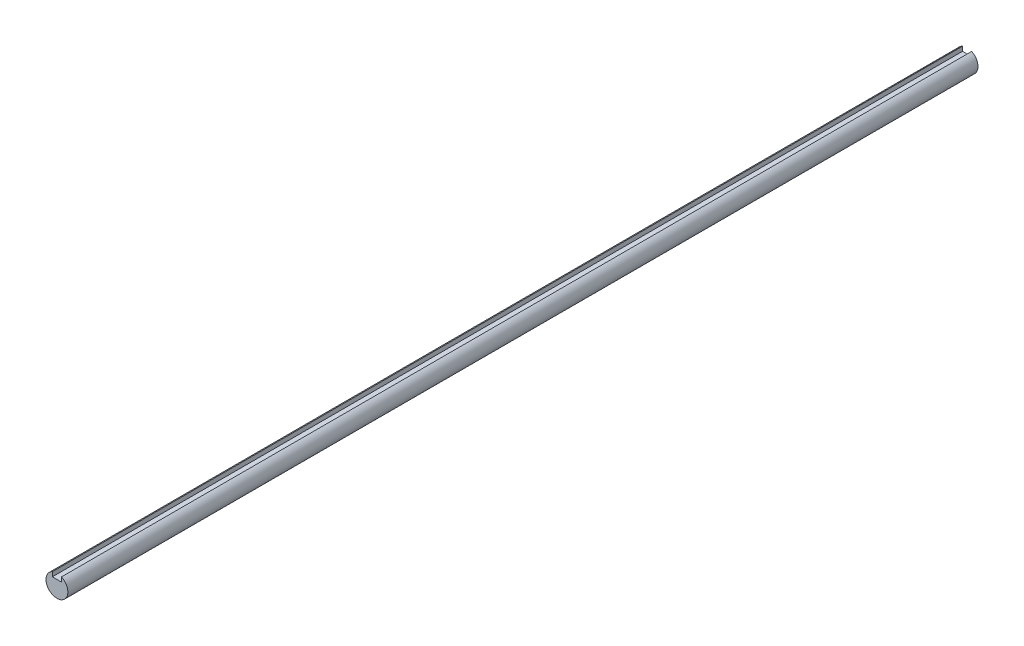
ISO-10303-21;
HEADER;
FILE_DESCRIPTION(('STEP AP214'),'2;1');
FILE_NAME('part.step','',(''),(''),'','','');
FILE_SCHEMA(('AUTOMOTIVE_DESIGN { 1 0 10303 214 1 1 1 1 }'));
ENDSEC;
DATA;
#1=APPLICATION_CONTEXT('core data for automotive mechanical design processes');
#2=APPLICATION_PROTOCOL_DEFINITION('international standard','automotive_design',2000,#1);
#3=PRODUCT_CONTEXT('',#1,'mechanical');
#4=PRODUCT('Part','Part','',(#3));
#5=PRODUCT_RELATED_PRODUCT_CATEGORY('part','',(#4));
#6=PRODUCT_DEFINITION_FORMATION('','',#4);
#7=PRODUCT_DEFINITION_CONTEXT('part definition',#1,'design');
#8=PRODUCT_DEFINITION('design','',#6,#7);
#9=PRODUCT_DEFINITION_SHAPE('','',#8);
#10=(LENGTH_UNIT() NAMED_UNIT(*) SI_UNIT(.MILLI.,.METRE.));
#11=(NAMED_UNIT(*) PLANE_ANGLE_UNIT() SI_UNIT($,.RADIAN.));
#12=(NAMED_UNIT(*) SI_UNIT($,.STERADIAN.) SOLID_ANGLE_UNIT());
#13=UNCERTAINTY_MEASURE_WITH_UNIT(LENGTH_MEASURE(1.E-05),#10,'distance_accuracy_value','');
#14=(GEOMETRIC_REPRESENTATION_CONTEXT(3) GLOBAL_UNCERTAINTY_ASSIGNED_CONTEXT((#13)) GLOBAL_UNIT_ASSIGNED_CONTEXT((#10,
#11,#12)) REPRESENTATION_CONTEXT('',''));
#15=CARTESIAN_POINT('',(0.,0.,0.));
#16=DIRECTION('',(0.,0.,1.));
#17=DIRECTION('',(1.,0.,0.));
#18=AXIS2_PLACEMENT_3D('',#15,#16,#17);
#19=CARTESIAN_POINT('',(0.,0.,250.));
#20=DIRECTION('',(0.,0.,-1.));
#21=DIRECTION('',(-1.,0.,0.));
#22=AXIS2_PLACEMENT_3D('',#19,#20,#21);
#23=CYLINDRICAL_SURFACE('',#22,6.);
#24=CARTESIAN_POINT('',(0.,0.,250.));
#25=DIRECTION('',(0.,0.,1.));
#26=DIRECTION('',(1.,0.,0.));
#27=AXIS2_PLACEMENT_3D('',#24,#25,#26);
#28=CIRCLE('',#27,6.);
#29=CARTESIAN_POINT('',(-2.5,5.45435605731786,250.));
#30=VERTEX_POINT('',#29);
#31=CARTESIAN_POINT('',(2.5,5.45435605731786,250.));
#32=VERTEX_POINT('',#31);
#33=EDGE_CURVE('E11',#30,#32,#28,.T.);
#34=ORIENTED_EDGE('',*,*,#33,.F.);
#35=DIRECTION('',(0.,0.,1.));
#36=VECTOR('',#35,1.);
#37=CARTESIAN_POINT('',(-2.5,5.45435605731786,-250.));
#38=LINE('',#37,#36);
#39=CARTESIAN_POINT('',(-2.5,5.45435605731786,-250.));
#40=VERTEX_POINT('',#39);
#41=EDGE_CURVE('E77',#40,#30,#38,.T.);
#42=ORIENTED_EDGE('',*,*,#41,.F.);
#43=CARTESIAN_POINT('',(0.,0.,-250.));
#44=DIRECTION('',(0.,0.,1.));
#45=DIRECTION('',(1.,0.,0.));
#46=AXIS2_PLACEMENT_3D('',#43,#44,#45);
#47=CIRCLE('',#46,6.);
#48=CARTESIAN_POINT('',(2.5,5.45435605731786,-250.));
#49=VERTEX_POINT('',#48);
#50=EDGE_CURVE('E42',#40,#49,#47,.T.);
#51=ORIENTED_EDGE('',*,*,#50,.T.);
#52=DIRECTION('',(0.,0.,1.));
#53=VECTOR('',#52,1.);
#54=CARTESIAN_POINT('',(2.5,5.45435605731786,-250.));
#55=LINE('',#54,#53);
#56=EDGE_CURVE('E105',#49,#32,#55,.T.);
#57=ORIENTED_EDGE('',*,*,#56,.T.);
#58=EDGE_LOOP('',(#34,#42,#51,#57));
#59=FACE_BOUND('',#58,.T.);
#60=ADVANCED_FACE('F39',(#59),#23,.T.);
#61=CARTESIAN_POINT('',(0.,0.,250.));
#62=DIRECTION('',(0.,0.,1.));
#63=DIRECTION('',(1.,0.,0.));
#64=AXIS2_PLACEMENT_3D('',#61,#62,#63);
#65=PLANE('',#64);
#66=DIRECTION('',(0.,-1.,0.));
#67=VECTOR('',#66,1.);
#68=CARTESIAN_POINT('',(-2.5,3.,250.));
#69=LINE('',#68,#67);
#70=CARTESIAN_POINT('',(-2.5,3.,250.));
#71=VERTEX_POINT('',#70);
#72=EDGE_CURVE('E82',#30,#71,#69,.T.);
#73=ORIENTED_EDGE('',*,*,#72,.F.);
#74=ORIENTED_EDGE('',*,*,#33,.T.);
#75=DIRECTION('',(0.,1.,0.));
#76=VECTOR('',#75,1.);
#77=CARTESIAN_POINT('',(2.5,3.,250.));
#78=LINE('',#77,#76);
#79=CARTESIAN_POINT('',(2.5,3.,250.));
#80=VERTEX_POINT('',#79);
#81=EDGE_CURVE('E96',#80,#32,#78,.T.);
#82=ORIENTED_EDGE('',*,*,#81,.F.);
#83=DIRECTION('',(1.,0.,0.));
#84=VECTOR('',#83,1.);
#85=CARTESIAN_POINT('',(2.5,3.,250.));
#86=LINE('',#85,#84);
#87=EDGE_CURVE('E98',#71,#80,#86,.T.);
#88=ORIENTED_EDGE('',*,*,#87,.F.);
#89=EDGE_LOOP('',(#73,#74,#82,#88));
#90=FACE_BOUND('',#89,.T.);
#91=ADVANCED_FACE('F111',(#90),#65,.T.);
#92=CARTESIAN_POINT('',(0.,0.,-250.));
#93=DIRECTION('',(0.,0.,1.));
#94=DIRECTION('',(1.,0.,0.));
#95=AXIS2_PLACEMENT_3D('',#92,#93,#94);
#96=PLANE('',#95);
#97=ORIENTED_EDGE('',*,*,#50,.F.);
#98=DIRECTION('',(0.,-1.,0.));
#99=VECTOR('',#98,1.);
#100=CARTESIAN_POINT('',(-2.5,3.,-250.));
#101=LINE('',#100,#99);
#102=CARTESIAN_POINT('',(-2.5,3.,-250.));
#103=VERTEX_POINT('',#102);
#104=EDGE_CURVE('E62',#40,#103,#101,.T.);
#105=ORIENTED_EDGE('',*,*,#104,.T.);
#106=DIRECTION('',(1.,0.,0.));
#107=VECTOR('',#106,1.);
#108=CARTESIAN_POINT('',(2.5,3.,-250.));
#109=LINE('',#108,#107);
#110=CARTESIAN_POINT('',(2.5,3.,-250.));
#111=VERTEX_POINT('',#110);
#112=EDGE_CURVE('E89',#103,#111,#109,.T.);
#113=ORIENTED_EDGE('',*,*,#112,.T.);
#114=DIRECTION('',(0.,1.,0.));
#115=VECTOR('',#114,1.);
#116=CARTESIAN_POINT('',(2.5,3.,-250.));
#117=LINE('',#116,#115);
#118=EDGE_CURVE('E53',#111,#49,#117,.T.);
#119=ORIENTED_EDGE('',*,*,#118,.T.);
#120=EDGE_LOOP('',(#97,#105,#113,#119));
#121=FACE_BOUND('',#120,.T.);
#122=ADVANCED_FACE('F94',(#121),#96,.F.);
#123=CARTESIAN_POINT('',(-2.5,3.,-250.));
#124=DIRECTION('',(-1.,0.,0.));
#125=DIRECTION('',(0.,0.,1.));
#126=AXIS2_PLACEMENT_3D('',#123,#124,#125);
#127=PLANE('',#126);
#128=ORIENTED_EDGE('',*,*,#72,.T.);
#129=DIRECTION('',(0.,0.,1.));
#130=VECTOR('',#129,1.);
#131=CARTESIAN_POINT('',(-2.5,3.,-250.));
#132=LINE('',#131,#130);
#133=EDGE_CURVE('E79',#103,#71,#132,.T.);
#134=ORIENTED_EDGE('',*,*,#133,.F.);
#135=ORIENTED_EDGE('',*,*,#104,.F.);
#136=ORIENTED_EDGE('',*,*,#41,.T.);
#137=EDGE_LOOP('',(#128,#134,#135,#136));
#138=FACE_BOUND('',#137,.T.);
#139=ADVANCED_FACE('F81',(#138),#127,.F.);
#140=CARTESIAN_POINT('',(2.5,3.,-250.));
#141=DIRECTION('',(1.,0.,0.));
#142=DIRECTION('',(0.,0.,-1.));
#143=AXIS2_PLACEMENT_3D('',#140,#141,#142);
#144=PLANE('',#143);
#145=ORIENTED_EDGE('',*,*,#81,.T.);
#146=ORIENTED_EDGE('',*,*,#56,.F.);
#147=ORIENTED_EDGE('',*,*,#118,.F.);
#148=DIRECTION('',(0.,0.,1.));
#149=VECTOR('',#148,1.);
#150=CARTESIAN_POINT('',(2.5,3.,-250.));
#151=LINE('',#150,#149);
#152=EDGE_CURVE('E86',#111,#80,#151,.T.);
#153=ORIENTED_EDGE('',*,*,#152,.T.);
#154=EDGE_LOOP('',(#145,#146,#147,#153));
#155=FACE_BOUND('',#154,.T.);
#156=ADVANCED_FACE('F108',(#155),#144,.F.);
#157=CARTESIAN_POINT('',(2.5,3.,-250.));
#158=DIRECTION('',(0.,-1.,0.));
#159=DIRECTION('',(0.,0.,-1.));
#160=AXIS2_PLACEMENT_3D('',#157,#158,#159);
#161=PLANE('',#160);
#162=ORIENTED_EDGE('',*,*,#87,.T.);
#163=ORIENTED_EDGE('',*,*,#152,.F.);
#164=ORIENTED_EDGE('',*,*,#112,.F.);
#165=ORIENTED_EDGE('',*,*,#133,.T.);
#166=EDGE_LOOP('',(#162,#163,#164,#165));
#167=FACE_BOUND('',#166,.T.);
#168=ADVANCED_FACE('F90',(#167),#161,.F.);
#169=CLOSED_SHELL('',(#60,#91,#122,#139,#156,#168));
#170=MANIFOLD_SOLID_BREP('B2',#169);
#171=ADVANCED_BREP_SHAPE_REPRESENTATION('',(#18,#170),#14);
#172=SHAPE_DEFINITION_REPRESENTATION(#9,#171);
ENDSEC;
END-ISO-10303-21;
